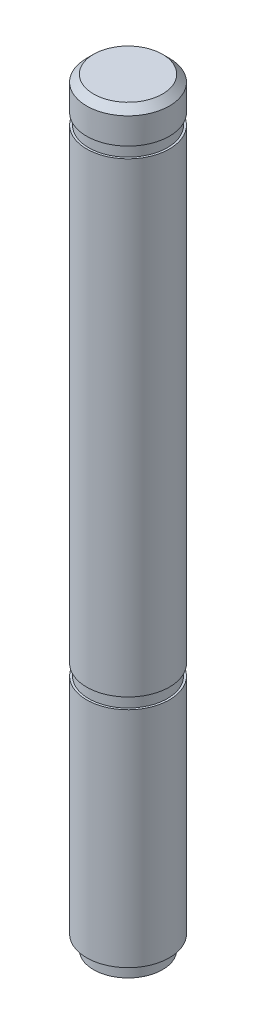
ISO-10303-21;
HEADER;
FILE_DESCRIPTION(('STEP AP214'),'2;1');
FILE_NAME('part.step','',(''),(''),'','','');
FILE_SCHEMA(('AUTOMOTIVE_DESIGN { 1 0 10303 214 1 1 1 1 }'));
ENDSEC;
DATA;
#1=APPLICATION_CONTEXT('core data for automotive mechanical design processes');
#2=APPLICATION_PROTOCOL_DEFINITION('international standard','automotive_design',2000,#1);
#3=PRODUCT_CONTEXT('',#1,'mechanical');
#4=PRODUCT('Part','Part','',(#3));
#5=PRODUCT_RELATED_PRODUCT_CATEGORY('part','',(#4));
#6=PRODUCT_DEFINITION_FORMATION('','',#4);
#7=PRODUCT_DEFINITION_CONTEXT('part definition',#1,'design');
#8=PRODUCT_DEFINITION('design','',#6,#7);
#9=PRODUCT_DEFINITION_SHAPE('','',#8);
#10=(LENGTH_UNIT() NAMED_UNIT(*) SI_UNIT(.MILLI.,.METRE.));
#11=(NAMED_UNIT(*) PLANE_ANGLE_UNIT() SI_UNIT($,.RADIAN.));
#12=(NAMED_UNIT(*) SI_UNIT($,.STERADIAN.) SOLID_ANGLE_UNIT());
#13=UNCERTAINTY_MEASURE_WITH_UNIT(LENGTH_MEASURE(1.E-05),#10,'distance_accuracy_value','');
#14=(GEOMETRIC_REPRESENTATION_CONTEXT(3) GLOBAL_UNCERTAINTY_ASSIGNED_CONTEXT((#13)) GLOBAL_UNIT_ASSIGNED_CONTEXT((#10,
#11,#12)) REPRESENTATION_CONTEXT('',''));
#15=CARTESIAN_POINT('',(0.,0.,0.));
#16=DIRECTION('',(0.,0.,1.));
#17=DIRECTION('',(1.,0.,0.));
#18=AXIS2_PLACEMENT_3D('',#15,#16,#17);
#19=CARTESIAN_POINT('',(0.,40.,0.));
#20=DIRECTION('',(0.,-1.,0.));
#21=DIRECTION('',(0.,0.,-1.));
#22=AXIS2_PLACEMENT_3D('',#19,#20,#21);
#23=CYLINDRICAL_SURFACE('',#22,3.);
#24=CARTESIAN_POINT('',(0.,2.2,0.));
#25=DIRECTION('',(0.,-1.,0.));
#26=DIRECTION('',(0.,0.,-1.));
#27=AXIS2_PLACEMENT_3D('',#24,#25,#26);
#28=CIRCLE('',#27,3.);
#29=CARTESIAN_POINT('',(0.,2.2,-3.));
#30=VERTEX_POINT('',#29);
#31=EDGE_CURVE('E61',#30,#30,#28,.T.);
#32=ORIENTED_EDGE('',*,*,#31,.T.);
#33=EDGE_LOOP('',(#32));
#34=FACE_BOUND('',#33,.T.);
#35=CARTESIAN_POINT('',(0.,-14.,0.));
#36=DIRECTION('',(0.,-1.,0.));
#37=DIRECTION('',(0.,0.,-1.));
#38=AXIS2_PLACEMENT_3D('',#35,#36,#37);
#39=CIRCLE('',#38,3.);
#40=CARTESIAN_POINT('',(0.,-14.,-3.));
#41=VERTEX_POINT('',#40);
#42=EDGE_CURVE('E70',#41,#41,#39,.T.);
#43=ORIENTED_EDGE('',*,*,#42,.F.);
#44=EDGE_LOOP('',(#43));
#45=FACE_BOUND('',#44,.T.);
#46=ADVANCED_FACE('F33',(#34,#45),#23,.T.);
#47=CARTESIAN_POINT('',(0.,36.8,0.));
#48=DIRECTION('',(0.,-1.,0.));
#49=DIRECTION('',(0.,0.,-1.));
#50=AXIS2_PLACEMENT_3D('',#47,#48,#49);
#51=CIRCLE('',#50,3.);
#52=CARTESIAN_POINT('',(0.,36.8,-3.));
#53=VERTEX_POINT('',#52);
#54=EDGE_CURVE('E49',#53,#53,#51,.T.);
#55=ORIENTED_EDGE('',*,*,#54,.T.);
#56=EDGE_LOOP('',(#55));
#57=FACE_BOUND('',#56,.T.);
#58=CARTESIAN_POINT('',(0.,3.,0.));
#59=DIRECTION('',(0.,-1.,0.));
#60=DIRECTION('',(0.,0.,-1.));
#61=AXIS2_PLACEMENT_3D('',#58,#59,#60);
#62=CIRCLE('',#61,3.);
#63=CARTESIAN_POINT('',(0.,3.,-3.));
#64=VERTEX_POINT('',#63);
#65=EDGE_CURVE('E58',#64,#64,#62,.T.);
#66=ORIENTED_EDGE('',*,*,#65,.F.);
#67=EDGE_LOOP('',(#66));
#68=FACE_BOUND('',#67,.T.);
#69=ADVANCED_FACE('F92',(#57,#68),#23,.T.);
#70=CARTESIAN_POINT('',(0.,39.5,0.));
#71=DIRECTION('',(0.,1.,0.));
#72=DIRECTION('',(0.,0.,1.));
#73=AXIS2_PLACEMENT_3D('',#70,#71,#72);
#74=CIRCLE('',#73,3.);
#75=CARTESIAN_POINT('',(0.,39.5,3.));
#76=VERTEX_POINT('',#75);
#77=EDGE_CURVE('E10',#76,#76,#74,.F.);
#78=ORIENTED_EDGE('',*,*,#77,.T.);
#79=EDGE_LOOP('',(#78));
#80=FACE_BOUND('',#79,.T.);
#81=CARTESIAN_POINT('',(0.,37.6,0.));
#82=DIRECTION('',(0.,-1.,0.));
#83=DIRECTION('',(0.,0.,-1.));
#84=AXIS2_PLACEMENT_3D('',#81,#82,#83);
#85=CIRCLE('',#84,3.);
#86=CARTESIAN_POINT('',(0.,37.6,-3.));
#87=VERTEX_POINT('',#86);
#88=EDGE_CURVE('E45',#87,#87,#85,.T.);
#89=ORIENTED_EDGE('',*,*,#88,.F.);
#90=EDGE_LOOP('',(#89));
#91=FACE_BOUND('',#90,.T.);
#92=ADVANCED_FACE('F94',(#80,#91),#23,.T.);
#93=CARTESIAN_POINT('',(0.,40.,0.));
#94=DIRECTION('',(0.,1.,0.));
#95=DIRECTION('',(0.,0.,1.));
#96=AXIS2_PLACEMENT_3D('',#93,#94,#95);
#97=PLANE('',#96);
#98=CARTESIAN_POINT('',(0.,40.,0.));
#99=DIRECTION('',(0.,1.,0.));
#100=DIRECTION('',(0.,0.,1.));
#101=AXIS2_PLACEMENT_3D('',#98,#99,#100);
#102=CIRCLE('',#101,2.50000000000001);
#103=CARTESIAN_POINT('',(0.,40.,2.50000000000001));
#104=VERTEX_POINT('',#103);
#105=EDGE_CURVE('E41',#104,#104,#102,.T.);
#106=ORIENTED_EDGE('',*,*,#105,.T.);
#107=EDGE_LOOP('',(#106));
#108=FACE_BOUND('',#107,.T.);
#109=ADVANCED_FACE('F101',(#108),#97,.T.);
#110=CARTESIAN_POINT('',(0.,37.6,0.));
#111=DIRECTION('',(0.,-1.,0.));
#112=DIRECTION('',(0.,0.,-1.));
#113=AXIS2_PLACEMENT_3D('',#110,#111,#112);
#114=PLANE('',#113);
#115=CARTESIAN_POINT('',(0.,37.6,0.));
#116=DIRECTION('',(0.,-1.,0.));
#117=DIRECTION('',(0.,0.,-1.));
#118=AXIS2_PLACEMENT_3D('',#115,#116,#117);
#119=CIRCLE('',#118,2.85);
#120=CARTESIAN_POINT('',(0.,37.6,-2.85));
#121=VERTEX_POINT('',#120);
#122=EDGE_CURVE('E53',#121,#121,#119,.T.);
#123=ORIENTED_EDGE('',*,*,#122,.F.);
#124=EDGE_LOOP('',(#123));
#125=FACE_BOUND('',#124,.T.);
#126=ORIENTED_EDGE('',*,*,#88,.T.);
#127=EDGE_LOOP('',(#126));
#128=FACE_BOUND('',#127,.T.);
#129=ADVANCED_FACE('F105',(#125,#128),#114,.T.);
#130=CARTESIAN_POINT('',(0.,36.8,0.));
#131=DIRECTION('',(0.,-1.,0.));
#132=DIRECTION('',(0.,0.,-1.));
#133=AXIS2_PLACEMENT_3D('',#130,#131,#132);
#134=PLANE('',#133);
#135=CARTESIAN_POINT('',(0.,36.8,0.));
#136=DIRECTION('',(0.,-1.,0.));
#137=DIRECTION('',(0.,0.,-1.));
#138=AXIS2_PLACEMENT_3D('',#135,#136,#137);
#139=CIRCLE('',#138,2.85);
#140=CARTESIAN_POINT('',(0.,36.8,-2.85));
#141=VERTEX_POINT('',#140);
#142=EDGE_CURVE('E55',#141,#141,#139,.T.);
#143=ORIENTED_EDGE('',*,*,#142,.T.);
#144=EDGE_LOOP('',(#143));
#145=FACE_BOUND('',#144,.T.);
#146=ORIENTED_EDGE('',*,*,#54,.F.);
#147=EDGE_LOOP('',(#146));
#148=FACE_BOUND('',#147,.T.);
#149=ADVANCED_FACE('F110',(#145,#148),#134,.F.);
#150=CARTESIAN_POINT('',(0.,37.6,0.));
#151=DIRECTION('',(0.,-1.,0.));
#152=DIRECTION('',(0.,0.,-1.));
#153=AXIS2_PLACEMENT_3D('',#150,#151,#152);
#154=CYLINDRICAL_SURFACE('',#153,2.85);
#155=ORIENTED_EDGE('',*,*,#122,.T.);
#156=EDGE_LOOP('',(#155));
#157=FACE_BOUND('',#156,.T.);
#158=ORIENTED_EDGE('',*,*,#142,.F.);
#159=EDGE_LOOP('',(#158));
#160=FACE_BOUND('',#159,.T.);
#161=ADVANCED_FACE('F116',(#157,#160),#154,.T.);
#162=CARTESIAN_POINT('',(0.,3.,0.));
#163=DIRECTION('',(0.,-1.,0.));
#164=DIRECTION('',(0.,0.,-1.));
#165=AXIS2_PLACEMENT_3D('',#162,#163,#164);
#166=PLANE('',#165);
#167=CARTESIAN_POINT('',(0.,3.,0.));
#168=DIRECTION('',(0.,-1.,0.));
#169=DIRECTION('',(0.,0.,-1.));
#170=AXIS2_PLACEMENT_3D('',#167,#168,#169);
#171=CIRCLE('',#170,2.85);
#172=CARTESIAN_POINT('',(0.,3.,-2.85));
#173=VERTEX_POINT('',#172);
#174=EDGE_CURVE('E64',#173,#173,#171,.T.);
#175=ORIENTED_EDGE('',*,*,#174,.F.);
#176=EDGE_LOOP('',(#175));
#177=FACE_BOUND('',#176,.T.);
#178=ORIENTED_EDGE('',*,*,#65,.T.);
#179=EDGE_LOOP('',(#178));
#180=FACE_BOUND('',#179,.T.);
#181=ADVANCED_FACE('F123',(#177,#180),#166,.T.);
#182=CARTESIAN_POINT('',(0.,2.2,0.));
#183=DIRECTION('',(0.,-1.,0.));
#184=DIRECTION('',(0.,0.,-1.));
#185=AXIS2_PLACEMENT_3D('',#182,#183,#184);
#186=PLANE('',#185);
#187=CARTESIAN_POINT('',(0.,2.2,0.));
#188=DIRECTION('',(0.,-1.,0.));
#189=DIRECTION('',(0.,0.,-1.));
#190=AXIS2_PLACEMENT_3D('',#187,#188,#189);
#191=CIRCLE('',#190,2.85);
#192=CARTESIAN_POINT('',(0.,2.2,-2.85));
#193=VERTEX_POINT('',#192);
#194=EDGE_CURVE('E67',#193,#193,#191,.T.);
#195=ORIENTED_EDGE('',*,*,#194,.T.);
#196=EDGE_LOOP('',(#195));
#197=FACE_BOUND('',#196,.T.);
#198=ORIENTED_EDGE('',*,*,#31,.F.);
#199=EDGE_LOOP('',(#198));
#200=FACE_BOUND('',#199,.T.);
#201=ADVANCED_FACE('F125',(#197,#200),#186,.F.);
#202=CARTESIAN_POINT('',(0.,3.,0.));
#203=DIRECTION('',(0.,-1.,0.));
#204=DIRECTION('',(0.,0.,-1.));
#205=AXIS2_PLACEMENT_3D('',#202,#203,#204);
#206=CYLINDRICAL_SURFACE('',#205,2.85);
#207=ORIENTED_EDGE('',*,*,#174,.T.);
#208=EDGE_LOOP('',(#207));
#209=FACE_BOUND('',#208,.T.);
#210=ORIENTED_EDGE('',*,*,#194,.F.);
#211=EDGE_LOOP('',(#210));
#212=FACE_BOUND('',#211,.T.);
#213=ADVANCED_FACE('F128',(#209,#212),#206,.T.);
#214=CARTESIAN_POINT('',(0.,40.,0.));
#215=DIRECTION('',(0.,-1.,0.));
#216=DIRECTION('',(0.,0.,-1.));
#217=AXIS2_PLACEMENT_3D('',#214,#215,#216);
#218=CONICAL_SURFACE('',#217,2.50000000000001,0.785398163397443);
#219=ORIENTED_EDGE('',*,*,#77,.F.);
#220=EDGE_LOOP('',(#219));
#221=FACE_BOUND('',#220,.T.);
#222=ORIENTED_EDGE('',*,*,#105,.F.);
#223=EDGE_LOOP('',(#222));
#224=FACE_BOUND('',#223,.T.);
#225=ADVANCED_FACE('F36',(#221,#224),#218,.T.);
#226=CARTESIAN_POINT('',(0.,-14.,0.));
#227=DIRECTION('',(0.,-1.,0.));
#228=DIRECTION('',(0.,0.,-1.));
#229=AXIS2_PLACEMENT_3D('',#226,#227,#228);
#230=PLANE('',#229);
#231=CARTESIAN_POINT('',(0.,-14.,0.));
#232=DIRECTION('',(0.,-1.,0.));
#233=DIRECTION('',(0.,0.,-1.));
#234=AXIS2_PLACEMENT_3D('',#231,#232,#233);
#235=CIRCLE('',#234,2.5);
#236=CARTESIAN_POINT('',(0.,-14.,-2.5));
#237=VERTEX_POINT('',#236);
#238=EDGE_CURVE('E75',#237,#237,#235,.T.);
#239=ORIENTED_EDGE('',*,*,#238,.F.);
#240=EDGE_LOOP('',(#239));
#241=FACE_BOUND('',#240,.T.);
#242=ORIENTED_EDGE('',*,*,#42,.T.);
#243=EDGE_LOOP('',(#242));
#244=FACE_BOUND('',#243,.T.);
#245=ADVANCED_FACE('F85',(#241,#244),#230,.T.);
#246=CARTESIAN_POINT('',(0.,-14.,0.));
#247=DIRECTION('',(0.,-1.,0.));
#248=DIRECTION('',(0.,0.,-1.));
#249=AXIS2_PLACEMENT_3D('',#246,#247,#248);
#250=CYLINDRICAL_SURFACE('',#249,2.5);
#251=ORIENTED_EDGE('',*,*,#238,.T.);
#252=EDGE_LOOP('',(#251));
#253=FACE_BOUND('',#252,.T.);
#254=CARTESIAN_POINT('',(0.,-15.,0.));
#255=DIRECTION('',(0.,-1.,0.));
#256=DIRECTION('',(0.,0.,-1.));
#257=AXIS2_PLACEMENT_3D('',#254,#255,#256);
#258=CIRCLE('',#257,2.5);
#259=CARTESIAN_POINT('',(0.,-15.,-2.5));
#260=VERTEX_POINT('',#259);
#261=EDGE_CURVE('E76',#260,#260,#258,.T.);
#262=ORIENTED_EDGE('',*,*,#261,.F.);
#263=EDGE_LOOP('',(#262));
#264=FACE_BOUND('',#263,.T.);
#265=ADVANCED_FACE('F82',(#253,#264),#250,.T.);
#266=CARTESIAN_POINT('',(0.,-15.,0.));
#267=DIRECTION('',(0.,-1.,0.));
#268=DIRECTION('',(0.,0.,-1.));
#269=AXIS2_PLACEMENT_3D('',#266,#267,#268);
#270=PLANE('',#269);
#271=ORIENTED_EDGE('',*,*,#261,.T.);
#272=EDGE_LOOP('',(#271));
#273=FACE_BOUND('',#272,.T.);
#274=ADVANCED_FACE('F136',(#273),#270,.T.);
#275=CLOSED_SHELL('',(#46,#69,#92,#109,#129,#149,#161,#181,#201,#213,#225,#245,#265,#274));
#276=MANIFOLD_SOLID_BREP('B2',#275);
#277=ADVANCED_BREP_SHAPE_REPRESENTATION('',(#18,#276),#14);
#278=SHAPE_DEFINITION_REPRESENTATION(#9,#277);
ENDSEC;
END-ISO-10303-21;
